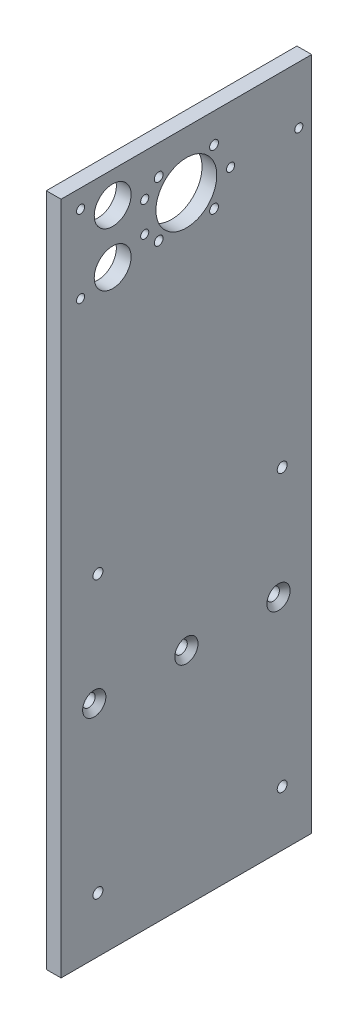
ISO-10303-21;
HEADER;
FILE_DESCRIPTION(('STEP AP214'),'2;1');
FILE_NAME('part.step','',(''),(''),'','','');
FILE_SCHEMA(('AUTOMOTIVE_DESIGN { 1 0 10303 214 1 1 1 1 }'));
ENDSEC;
DATA;
#1=APPLICATION_CONTEXT('core data for automotive mechanical design processes');
#2=APPLICATION_PROTOCOL_DEFINITION('international standard','automotive_design',2000,#1);
#3=PRODUCT_CONTEXT('',#1,'mechanical');
#4=PRODUCT('Part','Part','',(#3));
#5=PRODUCT_RELATED_PRODUCT_CATEGORY('part','',(#4));
#6=PRODUCT_DEFINITION_FORMATION('','',#4);
#7=PRODUCT_DEFINITION_CONTEXT('part definition',#1,'design');
#8=PRODUCT_DEFINITION('design','',#6,#7);
#9=PRODUCT_DEFINITION_SHAPE('','',#8);
#10=(LENGTH_UNIT() NAMED_UNIT(*) SI_UNIT(.MILLI.,.METRE.));
#11=(NAMED_UNIT(*) PLANE_ANGLE_UNIT() SI_UNIT($,.RADIAN.));
#12=(NAMED_UNIT(*) SI_UNIT($,.STERADIAN.) SOLID_ANGLE_UNIT());
#13=UNCERTAINTY_MEASURE_WITH_UNIT(LENGTH_MEASURE(1.E-05),#10,'distance_accuracy_value','');
#14=(GEOMETRIC_REPRESENTATION_CONTEXT(3) GLOBAL_UNCERTAINTY_ASSIGNED_CONTEXT((#13)) GLOBAL_UNIT_ASSIGNED_CONTEXT((#10,
#11,#12)) REPRESENTATION_CONTEXT('',''));
#15=CARTESIAN_POINT('',(0.,0.,0.));
#16=DIRECTION('',(0.,0.,1.));
#17=DIRECTION('',(1.,0.,0.));
#18=AXIS2_PLACEMENT_3D('',#15,#16,#17);
#19=CARTESIAN_POINT('',(4.,0.,0.));
#20=DIRECTION('',(-1.,0.,0.));
#21=DIRECTION('',(0.,0.,1.));
#22=AXIS2_PLACEMENT_3D('',#19,#20,#21);
#23=PLANE('',#22);
#24=CARTESIAN_POINT('',(4.,-75.,-26.));
#25=DIRECTION('',(1.,0.,0.));
#26=DIRECTION('',(0.,0.,-1.));
#27=AXIS2_PLACEMENT_3D('',#24,#25,#26);
#28=CIRCLE('',#27,1.35);
#29=CARTESIAN_POINT('',(4.,-75.,-27.35));
#30=VERTEX_POINT('',#29);
#31=EDGE_CURVE('E306',#30,#30,#28,.T.);
#32=ORIENTED_EDGE('',*,*,#31,.F.);
#33=EDGE_LOOP('',(#32));
#34=FACE_BOUND('',#33,.T.);
#35=CARTESIAN_POINT('',(4.,0.,-26.));
#36=DIRECTION('',(1.,0.,0.));
#37=DIRECTION('',(0.,0.,-1.));
#38=AXIS2_PLACEMENT_3D('',#35,#36,#37);
#39=CIRCLE('',#38,1.35);
#40=CARTESIAN_POINT('',(4.,0.,-27.35));
#41=VERTEX_POINT('',#40);
#42=EDGE_CURVE('E300',#41,#41,#39,.T.);
#43=ORIENTED_EDGE('',*,*,#42,.F.);
#44=EDGE_LOOP('',(#43));
#45=FACE_BOUND('',#44,.T.);
#46=CARTESIAN_POINT('',(4.,-75.,24.));
#47=DIRECTION('',(1.,0.,0.));
#48=DIRECTION('',(0.,0.,-1.));
#49=AXIS2_PLACEMENT_3D('',#46,#47,#48);
#50=CIRCLE('',#49,1.35);
#51=CARTESIAN_POINT('',(4.,-75.,22.65));
#52=VERTEX_POINT('',#51);
#53=EDGE_CURVE('E287',#52,#52,#50,.T.);
#54=ORIENTED_EDGE('',*,*,#53,.F.);
#55=EDGE_LOOP('',(#54));
#56=FACE_BOUND('',#55,.T.);
#57=CARTESIAN_POINT('',(4.,70.,20.));
#58=DIRECTION('',(-1.,0.,0.));
#59=DIRECTION('',(0.,0.,1.));
#60=AXIS2_PLACEMENT_3D('',#57,#58,#59);
#61=CIRCLE('',#60,5.);
#62=CARTESIAN_POINT('',(4.,70.,25.));
#63=VERTEX_POINT('',#62);
#64=EDGE_CURVE('E123',#63,#63,#61,.T.);
#65=ORIENTED_EDGE('',*,*,#64,.T.);
#66=EDGE_LOOP('',(#65));
#67=FACE_BOUND('',#66,.T.);
#68=CARTESIAN_POINT('',(4.,84.6,20.));
#69=DIRECTION('',(-1.,0.,0.));
#70=DIRECTION('',(0.,0.,1.));
#71=AXIS2_PLACEMENT_3D('',#68,#69,#70);
#72=CIRCLE('',#71,5.);
#73=CARTESIAN_POINT('',(4.,84.6,25.));
#74=VERTEX_POINT('',#73);
#75=EDGE_CURVE('E129',#74,#74,#72,.T.);
#76=ORIENTED_EDGE('',*,*,#75,.T.);
#77=EDGE_LOOP('',(#76));
#78=FACE_BOUND('',#77,.T.);
#79=CARTESIAN_POINT('',(4.,88.,28.7));
#80=DIRECTION('',(-1.,0.,0.));
#81=DIRECTION('',(0.,0.,1.));
#82=AXIS2_PLACEMENT_3D('',#79,#80,#81);
#83=CIRCLE('',#82,1.1);
#84=CARTESIAN_POINT('',(4.,88.,29.8));
#85=VERTEX_POINT('',#84);
#86=EDGE_CURVE('E137',#85,#85,#83,.T.);
#87=ORIENTED_EDGE('',*,*,#86,.T.);
#88=EDGE_LOOP('',(#87));
#89=FACE_BOUND('',#88,.T.);
#90=CARTESIAN_POINT('',(4.,67.,28.7));
#91=DIRECTION('',(-1.,0.,0.));
#92=DIRECTION('',(0.,0.,1.));
#93=AXIS2_PLACEMENT_3D('',#90,#91,#92);
#94=CIRCLE('',#93,1.1);
#95=CARTESIAN_POINT('',(4.,67.,29.8));
#96=VERTEX_POINT('',#95);
#97=EDGE_CURVE('E143',#96,#96,#94,.T.);
#98=ORIENTED_EDGE('',*,*,#97,.T.);
#99=EDGE_LOOP('',(#98));
#100=FACE_BOUND('',#99,.T.);
#101=CARTESIAN_POINT('',(4.,81.6,11.3));
#102=DIRECTION('',(-1.,0.,0.));
#103=DIRECTION('',(0.,0.,1.));
#104=AXIS2_PLACEMENT_3D('',#101,#102,#103);
#105=CIRCLE('',#104,1.1);
#106=CARTESIAN_POINT('',(4.,81.6,12.4));
#107=VERTEX_POINT('',#106);
#108=EDGE_CURVE('E149',#107,#107,#105,.T.);
#109=ORIENTED_EDGE('',*,*,#108,.T.);
#110=EDGE_LOOP('',(#109));
#111=FACE_BOUND('',#110,.T.);
#112=CARTESIAN_POINT('',(4.,73.4,11.3));
#113=DIRECTION('',(-1.,0.,0.));
#114=DIRECTION('',(0.,0.,1.));
#115=AXIS2_PLACEMENT_3D('',#112,#113,#114);
#116=CIRCLE('',#115,1.1);
#117=CARTESIAN_POINT('',(4.,73.4,12.4));
#118=VERTEX_POINT('',#117);
#119=EDGE_CURVE('E155',#118,#118,#116,.T.);
#120=ORIENTED_EDGE('',*,*,#119,.T.);
#121=EDGE_LOOP('',(#120));
#122=FACE_BOUND('',#121,.T.);
#123=CARTESIAN_POINT('',(4.,77.5,-12.));
#124=DIRECTION('',(1.,0.,0.));
#125=DIRECTION('',(0.,0.,-1.));
#126=AXIS2_PLACEMENT_3D('',#123,#124,#125);
#127=CIRCLE('',#126,1.1);
#128=CARTESIAN_POINT('',(4.,77.5,-13.1));
#129=VERTEX_POINT('',#128);
#130=EDGE_CURVE('E169',#129,#129,#127,.T.);
#131=ORIENTED_EDGE('',*,*,#130,.F.);
#132=EDGE_LOOP('',(#131));
#133=FACE_BOUND('',#132,.T.);
#134=CARTESIAN_POINT('',(4.,77.5,-30.5));
#135=DIRECTION('',(1.,0.,0.));
#136=DIRECTION('',(0.,0.,-1.));
#137=AXIS2_PLACEMENT_3D('',#134,#135,#136);
#138=CIRCLE('',#137,1.1);
#139=CARTESIAN_POINT('',(4.,77.5,-31.6));
#140=VERTEX_POINT('',#139);
#141=EDGE_CURVE('E175',#140,#140,#138,.T.);
#142=ORIENTED_EDGE('',*,*,#141,.F.);
#143=EDGE_LOOP('',(#142));
#144=FACE_BOUND('',#143,.T.);
#145=CARTESIAN_POINT('',(4.,-30.,25.));
#146=DIRECTION('',(1.,0.,0.));
#147=DIRECTION('',(0.,0.,-1.));
#148=AXIS2_PLACEMENT_3D('',#145,#146,#147);
#149=CIRCLE('',#148,3.15);
#150=CARTESIAN_POINT('',(4.,-30.,21.85));
#151=VERTEX_POINT('',#150);
#152=EDGE_CURVE('E181',#151,#151,#149,.T.);
#153=ORIENTED_EDGE('',*,*,#152,.F.);
#154=EDGE_LOOP('',(#153));
#155=FACE_BOUND('',#154,.T.);
#156=CARTESIAN_POINT('',(4.,-30.,0.));
#157=DIRECTION('',(1.,0.,0.));
#158=DIRECTION('',(0.,0.,-1.));
#159=AXIS2_PLACEMENT_3D('',#156,#157,#158);
#160=CIRCLE('',#159,3.15);
#161=CARTESIAN_POINT('',(4.,-30.,-3.15));
#162=VERTEX_POINT('',#161);
#163=EDGE_CURVE('E187',#162,#162,#160,.T.);
#164=ORIENTED_EDGE('',*,*,#163,.F.);
#165=EDGE_LOOP('',(#164));
#166=FACE_BOUND('',#165,.T.);
#167=CARTESIAN_POINT('',(4.,-30.,-25.));
#168=DIRECTION('',(1.,0.,0.));
#169=DIRECTION('',(0.,0.,-1.));
#170=AXIS2_PLACEMENT_3D('',#167,#168,#169);
#171=CIRCLE('',#170,3.15);
#172=CARTESIAN_POINT('',(4.,-30.,-28.15));
#173=VERTEX_POINT('',#172);
#174=EDGE_CURVE('E194',#173,#173,#171,.T.);
#175=ORIENTED_EDGE('',*,*,#174,.F.);
#176=EDGE_LOOP('',(#175));
#177=FACE_BOUND('',#176,.T.);
#178=CARTESIAN_POINT('',(4.,77.5,0.));
#179=DIRECTION('',(-1.,0.,0.));
#180=DIRECTION('',(0.,0.,1.));
#181=AXIS2_PLACEMENT_3D('',#178,#179,#180);
#182=CIRCLE('',#181,8.25000000000001);
#183=CARTESIAN_POINT('',(4.,77.5,8.25000000000001));
#184=VERTEX_POINT('',#183);
#185=EDGE_CURVE('E201',#184,#184,#182,.T.);
#186=ORIENTED_EDGE('',*,*,#185,.T.);
#187=EDGE_LOOP('',(#186));
#188=FACE_BOUND('',#187,.T.);
#189=CARTESIAN_POINT('',(4.,85.,-7.50000000000003));
#190=DIRECTION('',(-1.,0.,0.));
#191=DIRECTION('',(0.,0.,1.));
#192=AXIS2_PLACEMENT_3D('',#189,#190,#191);
#193=CIRCLE('',#192,1.19999999999999);
#194=CARTESIAN_POINT('',(4.,85.,-6.30000000000004));
#195=VERTEX_POINT('',#194);
#196=EDGE_CURVE('E213',#195,#195,#193,.T.);
#197=ORIENTED_EDGE('',*,*,#196,.T.);
#198=EDGE_LOOP('',(#197));
#199=FACE_BOUND('',#198,.T.);
#200=CARTESIAN_POINT('',(4.,70.,-7.50000000000003));
#201=DIRECTION('',(-1.,0.,0.));
#202=DIRECTION('',(0.,0.,1.));
#203=AXIS2_PLACEMENT_3D('',#200,#201,#202);
#204=CIRCLE('',#203,1.19999999999999);
#205=CARTESIAN_POINT('',(4.,70.,-6.30000000000004));
#206=VERTEX_POINT('',#205);
#207=EDGE_CURVE('E220',#206,#206,#204,.T.);
#208=ORIENTED_EDGE('',*,*,#207,.T.);
#209=EDGE_LOOP('',(#208));
#210=FACE_BOUND('',#209,.T.);
#211=CARTESIAN_POINT('',(4.,85.,7.49999999999999));
#212=DIRECTION('',(-1.,0.,0.));
#213=DIRECTION('',(0.,0.,1.));
#214=AXIS2_PLACEMENT_3D('',#211,#212,#213);
#215=CIRCLE('',#214,1.19999999999999);
#216=CARTESIAN_POINT('',(4.,85.,8.69999999999998));
#217=VERTEX_POINT('',#216);
#218=EDGE_CURVE('E227',#217,#217,#215,.T.);
#219=ORIENTED_EDGE('',*,*,#218,.T.);
#220=EDGE_LOOP('',(#219));
#221=FACE_BOUND('',#220,.T.);
#222=CARTESIAN_POINT('',(4.,70.,7.50000000000003));
#223=DIRECTION('',(-1.,0.,0.));
#224=DIRECTION('',(0.,0.,1.));
#225=AXIS2_PLACEMENT_3D('',#222,#223,#224);
#226=CIRCLE('',#225,1.19999999999999);
#227=CARTESIAN_POINT('',(4.,70.,8.70000000000002));
#228=VERTEX_POINT('',#227);
#229=EDGE_CURVE('E234',#228,#228,#226,.T.);
#230=ORIENTED_EDGE('',*,*,#229,.T.);
#231=EDGE_LOOP('',(#230));
#232=FACE_BOUND('',#231,.T.);
#233=DIRECTION('',(0.,1.,0.));
#234=VECTOR('',#233,1.);
#235=CARTESIAN_POINT('',(4.,-90.,-34.));
#236=LINE('',#235,#234);
#237=CARTESIAN_POINT('',(4.,-90.,-34.));
#238=VERTEX_POINT('',#237);
#239=CARTESIAN_POINT('',(4.,93.,-34.));
#240=VERTEX_POINT('',#239);
#241=EDGE_CURVE('E235',#238,#240,#236,.T.);
#242=ORIENTED_EDGE('',*,*,#241,.T.);
#243=DIRECTION('',(0.,0.,-1.));
#244=VECTOR('',#243,1.);
#245=CARTESIAN_POINT('',(4.,93.,-34.));
#246=LINE('',#245,#244);
#247=CARTESIAN_POINT('',(4.,93.,34.));
#248=VERTEX_POINT('',#247);
#249=EDGE_CURVE('E164',#248,#240,#246,.T.);
#250=ORIENTED_EDGE('',*,*,#249,.F.);
#251=DIRECTION('',(0.,-1.,0.));
#252=VECTOR('',#251,1.);
#253=CARTESIAN_POINT('',(4.,-90.,34.));
#254=LINE('',#253,#252);
#255=CARTESIAN_POINT('',(4.,-90.,34.));
#256=VERTEX_POINT('',#255);
#257=EDGE_CURVE('E237',#248,#256,#254,.T.);
#258=ORIENTED_EDGE('',*,*,#257,.T.);
#259=DIRECTION('',(0.,0.,-1.));
#260=VECTOR('',#259,1.);
#261=CARTESIAN_POINT('',(4.,-90.,34.));
#262=LINE('',#261,#260);
#263=EDGE_CURVE('E56',#256,#238,#262,.T.);
#264=ORIENTED_EDGE('',*,*,#263,.T.);
#265=EDGE_LOOP('',(#242,#250,#258,#264));
#266=FACE_BOUND('',#265,.T.);
#267=CARTESIAN_POINT('',(4.,0.,24.));
#268=DIRECTION('',(1.,0.,0.));
#269=DIRECTION('',(0.,0.,-1.));
#270=AXIS2_PLACEMENT_3D('',#267,#268,#269);
#271=CIRCLE('',#270,1.35);
#272=CARTESIAN_POINT('',(4.,0.,22.65));
#273=VERTEX_POINT('',#272);
#274=EDGE_CURVE('E294',#273,#273,#271,.T.);
#275=ORIENTED_EDGE('',*,*,#274,.F.);
#276=EDGE_LOOP('',(#275));
#277=FACE_BOUND('',#276,.T.);
#278=ADVANCED_FACE('F37',(#34,#45,#56,#67,#78,#89,#100,#111,#122,#133,#144,#155,#166,#177,#188,
#199,#210,#221,#232,#266,#277),#23,.F.);
#279=CARTESIAN_POINT('',(0.,0.,0.));
#280=DIRECTION('',(-1.,0.,0.));
#281=DIRECTION('',(0.,0.,1.));
#282=AXIS2_PLACEMENT_3D('',#279,#280,#281);
#283=PLANE('',#282);
#284=CARTESIAN_POINT('',(0.,-75.,-26.));
#285=DIRECTION('',(1.,0.,0.));
#286=DIRECTION('',(0.,0.,-1.));
#287=AXIS2_PLACEMENT_3D('',#284,#285,#286);
#288=CIRCLE('',#287,1.35);
#289=CARTESIAN_POINT('',(0.,-75.,-27.35));
#290=VERTEX_POINT('',#289);
#291=EDGE_CURVE('E303',#290,#290,#288,.T.);
#292=ORIENTED_EDGE('',*,*,#291,.T.);
#293=EDGE_LOOP('',(#292));
#294=FACE_BOUND('',#293,.T.);
#295=CARTESIAN_POINT('',(0.,0.,-26.));
#296=DIRECTION('',(1.,0.,0.));
#297=DIRECTION('',(0.,0.,-1.));
#298=AXIS2_PLACEMENT_3D('',#295,#296,#297);
#299=CIRCLE('',#298,1.35);
#300=CARTESIAN_POINT('',(0.,0.,-27.35));
#301=VERTEX_POINT('',#300);
#302=EDGE_CURVE('E297',#301,#301,#299,.T.);
#303=ORIENTED_EDGE('',*,*,#302,.T.);
#304=EDGE_LOOP('',(#303));
#305=FACE_BOUND('',#304,.T.);
#306=CARTESIAN_POINT('',(0.,0.,24.));
#307=DIRECTION('',(1.,0.,0.));
#308=DIRECTION('',(0.,0.,-1.));
#309=AXIS2_PLACEMENT_3D('',#306,#307,#308);
#310=CIRCLE('',#309,1.35);
#311=CARTESIAN_POINT('',(0.,0.,22.65));
#312=VERTEX_POINT('',#311);
#313=EDGE_CURVE('E289',#312,#312,#310,.T.);
#314=ORIENTED_EDGE('',*,*,#313,.T.);
#315=EDGE_LOOP('',(#314));
#316=FACE_BOUND('',#315,.T.);
#317=DIRECTION('',(0.,1.,0.));
#318=VECTOR('',#317,1.);
#319=CARTESIAN_POINT('',(0.,-90.,-34.));
#320=LINE('',#319,#318);
#321=CARTESIAN_POINT('',(0.,-90.,-34.));
#322=VERTEX_POINT('',#321);
#323=CARTESIAN_POINT('',(0.,93.,-34.));
#324=VERTEX_POINT('',#323);
#325=EDGE_CURVE('E75',#322,#324,#320,.T.);
#326=ORIENTED_EDGE('',*,*,#325,.F.);
#327=DIRECTION('',(0.,0.,-1.));
#328=VECTOR('',#327,1.);
#329=CARTESIAN_POINT('',(0.,-90.,34.));
#330=LINE('',#329,#328);
#331=CARTESIAN_POINT('',(0.,-90.,34.));
#332=VERTEX_POINT('',#331);
#333=EDGE_CURVE('E238',#332,#322,#330,.T.);
#334=ORIENTED_EDGE('',*,*,#333,.F.);
#335=DIRECTION('',(0.,-1.,0.));
#336=VECTOR('',#335,1.);
#337=CARTESIAN_POINT('',(0.,-90.,34.));
#338=LINE('',#337,#336);
#339=CARTESIAN_POINT('',(0.,93.,34.));
#340=VERTEX_POINT('',#339);
#341=EDGE_CURVE('E67',#340,#332,#338,.T.);
#342=ORIENTED_EDGE('',*,*,#341,.F.);
#343=DIRECTION('',(0.,0.,1.));
#344=VECTOR('',#343,1.);
#345=CARTESIAN_POINT('',(0.,93.,-34.));
#346=LINE('',#345,#344);
#347=EDGE_CURVE('E158',#324,#340,#346,.T.);
#348=ORIENTED_EDGE('',*,*,#347,.F.);
#349=EDGE_LOOP('',(#326,#334,#342,#348));
#350=FACE_BOUND('',#349,.T.);
#351=CARTESIAN_POINT('',(0.,70.,7.50000000000003));
#352=DIRECTION('',(-1.,0.,0.));
#353=DIRECTION('',(0.,0.,1.));
#354=AXIS2_PLACEMENT_3D('',#351,#352,#353);
#355=CIRCLE('',#354,2.19999999999999);
#356=CARTESIAN_POINT('',(0.,70.,9.70000000000002));
#357=VERTEX_POINT('',#356);
#358=EDGE_CURVE('E228',#357,#357,#355,.T.);
#359=ORIENTED_EDGE('',*,*,#358,.F.);
#360=EDGE_LOOP('',(#359));
#361=FACE_BOUND('',#360,.T.);
#362=CARTESIAN_POINT('',(0.,85.,7.49999999999999));
#363=DIRECTION('',(-1.,0.,0.));
#364=DIRECTION('',(0.,0.,1.));
#365=AXIS2_PLACEMENT_3D('',#362,#363,#364);
#366=CIRCLE('',#365,2.19999999999999);
#367=CARTESIAN_POINT('',(0.,85.,9.69999999999999));
#368=VERTEX_POINT('',#367);
#369=EDGE_CURVE('E221',#368,#368,#366,.T.);
#370=ORIENTED_EDGE('',*,*,#369,.F.);
#371=EDGE_LOOP('',(#370));
#372=FACE_BOUND('',#371,.T.);
#373=CARTESIAN_POINT('',(0.,70.,-7.50000000000003));
#374=DIRECTION('',(-1.,0.,0.));
#375=DIRECTION('',(0.,0.,1.));
#376=AXIS2_PLACEMENT_3D('',#373,#374,#375);
#377=CIRCLE('',#376,2.19999999999999);
#378=CARTESIAN_POINT('',(0.,70.,-5.30000000000004));
#379=VERTEX_POINT('',#378);
#380=EDGE_CURVE('E214',#379,#379,#377,.T.);
#381=ORIENTED_EDGE('',*,*,#380,.F.);
#382=EDGE_LOOP('',(#381));
#383=FACE_BOUND('',#382,.T.);
#384=CARTESIAN_POINT('',(0.,85.,-7.50000000000003));
#385=DIRECTION('',(-1.,0.,0.));
#386=DIRECTION('',(0.,0.,1.));
#387=AXIS2_PLACEMENT_3D('',#384,#385,#386);
#388=CIRCLE('',#387,2.19999999999999);
#389=CARTESIAN_POINT('',(0.,85.,-5.30000000000003));
#390=VERTEX_POINT('',#389);
#391=EDGE_CURVE('E204',#390,#390,#388,.T.);
#392=ORIENTED_EDGE('',*,*,#391,.F.);
#393=EDGE_LOOP('',(#392));
#394=FACE_BOUND('',#393,.T.);
#395=CARTESIAN_POINT('',(0.,77.5,0.));
#396=DIRECTION('',(-1.,0.,0.));
#397=DIRECTION('',(0.,0.,1.));
#398=AXIS2_PLACEMENT_3D('',#395,#396,#397);
#399=CIRCLE('',#398,8.25000000000001);
#400=CARTESIAN_POINT('',(0.,77.5,8.25000000000001));
#401=VERTEX_POINT('',#400);
#402=EDGE_CURVE('E205',#401,#401,#399,.T.);
#403=ORIENTED_EDGE('',*,*,#402,.F.);
#404=EDGE_LOOP('',(#403));
#405=FACE_BOUND('',#404,.T.);
#406=CARTESIAN_POINT('',(0.,-30.,-25.));
#407=DIRECTION('',(-1.,0.,0.));
#408=DIRECTION('',(0.,0.,1.));
#409=AXIS2_PLACEMENT_3D('',#406,#407,#408);
#410=CIRCLE('',#409,1.7);
#411=CARTESIAN_POINT('',(0.,-30.,-23.3));
#412=VERTEX_POINT('',#411);
#413=EDGE_CURVE('E200',#412,#412,#410,.T.);
#414=ORIENTED_EDGE('',*,*,#413,.F.);
#415=EDGE_LOOP('',(#414));
#416=FACE_BOUND('',#415,.T.);
#417=CARTESIAN_POINT('',(0.,-30.,0.));
#418=DIRECTION('',(-1.,0.,0.));
#419=DIRECTION('',(0.,0.,1.));
#420=AXIS2_PLACEMENT_3D('',#417,#418,#419);
#421=CIRCLE('',#420,1.7);
#422=CARTESIAN_POINT('',(0.,-30.,1.7));
#423=VERTEX_POINT('',#422);
#424=EDGE_CURVE('E193',#423,#423,#421,.T.);
#425=ORIENTED_EDGE('',*,*,#424,.F.);
#426=EDGE_LOOP('',(#425));
#427=FACE_BOUND('',#426,.T.);
#428=CARTESIAN_POINT('',(0.,-30.,25.));
#429=DIRECTION('',(-1.,0.,0.));
#430=DIRECTION('',(0.,0.,1.));
#431=AXIS2_PLACEMENT_3D('',#428,#429,#430);
#432=CIRCLE('',#431,1.7);
#433=CARTESIAN_POINT('',(0.,-30.,26.7));
#434=VERTEX_POINT('',#433);
#435=EDGE_CURVE('E41',#434,#434,#432,.T.);
#436=ORIENTED_EDGE('',*,*,#435,.F.);
#437=EDGE_LOOP('',(#436));
#438=FACE_BOUND('',#437,.T.);
#439=CARTESIAN_POINT('',(0.,77.5,-30.5));
#440=DIRECTION('',(1.,0.,0.));
#441=DIRECTION('',(0.,0.,-1.));
#442=AXIS2_PLACEMENT_3D('',#439,#440,#441);
#443=CIRCLE('',#442,1.1);
#444=CARTESIAN_POINT('',(0.,77.5,-31.6));
#445=VERTEX_POINT('',#444);
#446=EDGE_CURVE('E178',#445,#445,#443,.T.);
#447=ORIENTED_EDGE('',*,*,#446,.T.);
#448=EDGE_LOOP('',(#447));
#449=FACE_BOUND('',#448,.T.);
#450=CARTESIAN_POINT('',(0.,77.5,-12.));
#451=DIRECTION('',(1.,0.,0.));
#452=DIRECTION('',(0.,0.,-1.));
#453=AXIS2_PLACEMENT_3D('',#450,#451,#452);
#454=CIRCLE('',#453,1.1);
#455=CARTESIAN_POINT('',(0.,77.5,-13.1));
#456=VERTEX_POINT('',#455);
#457=EDGE_CURVE('E172',#456,#456,#454,.T.);
#458=ORIENTED_EDGE('',*,*,#457,.T.);
#459=EDGE_LOOP('',(#458));
#460=FACE_BOUND('',#459,.T.);
#461=CARTESIAN_POINT('',(0.,73.4,11.3));
#462=DIRECTION('',(-1.,0.,0.));
#463=DIRECTION('',(0.,0.,1.));
#464=AXIS2_PLACEMENT_3D('',#461,#462,#463);
#465=CIRCLE('',#464,1.1);
#466=CARTESIAN_POINT('',(0.,73.4,12.4));
#467=VERTEX_POINT('',#466);
#468=EDGE_CURVE('E152',#467,#467,#465,.T.);
#469=ORIENTED_EDGE('',*,*,#468,.F.);
#470=EDGE_LOOP('',(#469));
#471=FACE_BOUND('',#470,.T.);
#472=CARTESIAN_POINT('',(0.,81.6,11.3));
#473=DIRECTION('',(-1.,0.,0.));
#474=DIRECTION('',(0.,0.,1.));
#475=AXIS2_PLACEMENT_3D('',#472,#473,#474);
#476=CIRCLE('',#475,1.1);
#477=CARTESIAN_POINT('',(0.,81.6,12.4));
#478=VERTEX_POINT('',#477);
#479=EDGE_CURVE('E146',#478,#478,#476,.T.);
#480=ORIENTED_EDGE('',*,*,#479,.F.);
#481=EDGE_LOOP('',(#480));
#482=FACE_BOUND('',#481,.T.);
#483=CARTESIAN_POINT('',(0.,67.,28.7));
#484=DIRECTION('',(-1.,0.,0.));
#485=DIRECTION('',(0.,0.,1.));
#486=AXIS2_PLACEMENT_3D('',#483,#484,#485);
#487=CIRCLE('',#486,1.1);
#488=CARTESIAN_POINT('',(0.,67.,29.8));
#489=VERTEX_POINT('',#488);
#490=EDGE_CURVE('E140',#489,#489,#487,.T.);
#491=ORIENTED_EDGE('',*,*,#490,.F.);
#492=EDGE_LOOP('',(#491));
#493=FACE_BOUND('',#492,.T.);
#494=CARTESIAN_POINT('',(0.,88.,28.7));
#495=DIRECTION('',(-1.,0.,0.));
#496=DIRECTION('',(0.,0.,1.));
#497=AXIS2_PLACEMENT_3D('',#494,#495,#496);
#498=CIRCLE('',#497,1.1);
#499=CARTESIAN_POINT('',(0.,88.,29.8));
#500=VERTEX_POINT('',#499);
#501=EDGE_CURVE('E132',#500,#500,#498,.T.);
#502=ORIENTED_EDGE('',*,*,#501,.F.);
#503=EDGE_LOOP('',(#502));
#504=FACE_BOUND('',#503,.T.);
#505=CARTESIAN_POINT('',(0.,84.6,20.));
#506=DIRECTION('',(-1.,0.,0.));
#507=DIRECTION('',(0.,0.,1.));
#508=AXIS2_PLACEMENT_3D('',#505,#506,#507);
#509=CIRCLE('',#508,5.);
#510=CARTESIAN_POINT('',(0.,84.6,25.));
#511=VERTEX_POINT('',#510);
#512=EDGE_CURVE('E126',#511,#511,#509,.T.);
#513=ORIENTED_EDGE('',*,*,#512,.F.);
#514=EDGE_LOOP('',(#513));
#515=FACE_BOUND('',#514,.T.);
#516=CARTESIAN_POINT('',(0.,70.,20.));
#517=DIRECTION('',(-1.,0.,0.));
#518=DIRECTION('',(0.,0.,1.));
#519=AXIS2_PLACEMENT_3D('',#516,#517,#518);
#520=CIRCLE('',#519,5.);
#521=CARTESIAN_POINT('',(0.,70.,25.));
#522=VERTEX_POINT('',#521);
#523=EDGE_CURVE('E122',#522,#522,#520,.T.);
#524=ORIENTED_EDGE('',*,*,#523,.F.);
#525=EDGE_LOOP('',(#524));
#526=FACE_BOUND('',#525,.T.);
#527=CARTESIAN_POINT('',(0.,-75.,24.));
#528=DIRECTION('',(1.,0.,0.));
#529=DIRECTION('',(0.,0.,-1.));
#530=AXIS2_PLACEMENT_3D('',#527,#528,#529);
#531=CIRCLE('',#530,1.35);
#532=CARTESIAN_POINT('',(0.,-75.,22.65));
#533=VERTEX_POINT('',#532);
#534=EDGE_CURVE('E110',#533,#533,#531,.T.);
#535=ORIENTED_EDGE('',*,*,#534,.T.);
#536=EDGE_LOOP('',(#535));
#537=FACE_BOUND('',#536,.T.);
#538=ADVANCED_FACE('F260',(#294,#305,#316,#350,#361,#372,#383,#394,#405,#416,#427,#438,#449,
#460,#471,#482,#493,#504,#515,#526,#537),#283,.T.);
#539=CARTESIAN_POINT('',(4.,-90.,-34.));
#540=DIRECTION('',(0.,0.,1.));
#541=DIRECTION('',(1.,0.,0.));
#542=AXIS2_PLACEMENT_3D('',#539,#540,#541);
#543=PLANE('',#542);
#544=ORIENTED_EDGE('',*,*,#325,.T.);
#545=DIRECTION('',(-1.,0.,0.));
#546=VECTOR('',#545,1.);
#547=CARTESIAN_POINT('',(0.,93.,-34.));
#548=LINE('',#547,#546);
#549=EDGE_CURVE('E167',#240,#324,#548,.T.);
#550=ORIENTED_EDGE('',*,*,#549,.F.);
#551=ORIENTED_EDGE('',*,*,#241,.F.);
#552=DIRECTION('',(-1.,0.,0.));
#553=VECTOR('',#552,1.);
#554=CARTESIAN_POINT('',(4.,-90.,-34.));
#555=LINE('',#554,#553);
#556=EDGE_CURVE('E47',#238,#322,#555,.T.);
#557=ORIENTED_EDGE('',*,*,#556,.T.);
#558=EDGE_LOOP('',(#544,#550,#551,#557));
#559=FACE_BOUND('',#558,.T.);
#560=ADVANCED_FACE('F39',(#559),#543,.F.);
#561=CARTESIAN_POINT('',(4.,-90.,34.));
#562=DIRECTION('',(0.,0.,-1.));
#563=DIRECTION('',(-1.,0.,0.));
#564=AXIS2_PLACEMENT_3D('',#561,#562,#563);
#565=PLANE('',#564);
#566=ORIENTED_EDGE('',*,*,#341,.T.);
#567=DIRECTION('',(-1.,0.,0.));
#568=VECTOR('',#567,1.);
#569=CARTESIAN_POINT('',(4.,-90.,34.));
#570=LINE('',#569,#568);
#571=EDGE_CURVE('E11',#256,#332,#570,.T.);
#572=ORIENTED_EDGE('',*,*,#571,.F.);
#573=ORIENTED_EDGE('',*,*,#257,.F.);
#574=DIRECTION('',(1.,0.,0.));
#575=VECTOR('',#574,1.);
#576=CARTESIAN_POINT('',(0.,93.,34.));
#577=LINE('',#576,#575);
#578=EDGE_CURVE('E161',#340,#248,#577,.T.);
#579=ORIENTED_EDGE('',*,*,#578,.F.);
#580=EDGE_LOOP('',(#566,#572,#573,#579));
#581=FACE_BOUND('',#580,.T.);
#582=ADVANCED_FACE('F484',(#581),#565,.F.);
#583=CARTESIAN_POINT('',(4.,-90.,34.));
#584=DIRECTION('',(0.,1.,0.));
#585=DIRECTION('',(0.,0.,1.));
#586=AXIS2_PLACEMENT_3D('',#583,#584,#585);
#587=PLANE('',#586);
#588=CARTESIAN_POINT('',(2.,-90.,0.));
#589=DIRECTION('',(0.,-1.,0.));
#590=DIRECTION('',(0.,0.,-1.));
#591=AXIS2_PLACEMENT_3D('',#588,#589,#590);
#592=CIRCLE('',#591,1.1);
#593=CARTESIAN_POINT('',(2.,-90.,-1.1));
#594=VERTEX_POINT('',#593);
#595=EDGE_CURVE('E104',#594,#594,#592,.T.);
#596=ORIENTED_EDGE('',*,*,#595,.F.);
#597=EDGE_LOOP('',(#596));
#598=FACE_BOUND('',#597,.T.);
#599=CARTESIAN_POINT('',(2.,-90.,25.));
#600=DIRECTION('',(0.,-1.,0.));
#601=DIRECTION('',(0.,0.,-1.));
#602=AXIS2_PLACEMENT_3D('',#599,#600,#601);
#603=CIRCLE('',#602,1.1);
#604=CARTESIAN_POINT('',(2.,-90.,23.9));
#605=VERTEX_POINT('',#604);
#606=EDGE_CURVE('E103',#605,#605,#603,.T.);
#607=ORIENTED_EDGE('',*,*,#606,.F.);
#608=EDGE_LOOP('',(#607));
#609=FACE_BOUND('',#608,.T.);
#610=CARTESIAN_POINT('',(2.,-90.,-25.));
#611=DIRECTION('',(0.,-1.,0.));
#612=DIRECTION('',(0.,0.,-1.));
#613=AXIS2_PLACEMENT_3D('',#610,#611,#612);
#614=CIRCLE('',#613,1.1);
#615=CARTESIAN_POINT('',(2.,-90.,-26.1));
#616=VERTEX_POINT('',#615);
#617=EDGE_CURVE('E116',#616,#616,#614,.T.);
#618=ORIENTED_EDGE('',*,*,#617,.F.);
#619=EDGE_LOOP('',(#618));
#620=FACE_BOUND('',#619,.T.);
#621=ORIENTED_EDGE('',*,*,#333,.T.);
#622=ORIENTED_EDGE('',*,*,#556,.F.);
#623=ORIENTED_EDGE('',*,*,#263,.F.);
#624=ORIENTED_EDGE('',*,*,#571,.T.);
#625=EDGE_LOOP('',(#621,#622,#623,#624));
#626=FACE_BOUND('',#625,.T.);
#627=ADVANCED_FACE('F480',(#598,#609,#620,#626),#587,.F.);
#628=CARTESIAN_POINT('',(0.,70.,7.50000000000003));
#629=DIRECTION('',(-1.,0.,0.));
#630=DIRECTION('',(0.,0.,1.));
#631=AXIS2_PLACEMENT_3D('',#628,#629,#630);
#632=CYLINDRICAL_SURFACE('',#631,1.19999999999999);
#633=CARTESIAN_POINT('',(1.,70.,7.50000000000003));
#634=DIRECTION('',(-1.,0.,0.));
#635=DIRECTION('',(0.,0.,1.));
#636=AXIS2_PLACEMENT_3D('',#633,#634,#635);
#637=CIRCLE('',#636,1.19999999999999);
#638=CARTESIAN_POINT('',(1.,70.,8.70000000000002));
#639=VERTEX_POINT('',#638);
#640=EDGE_CURVE('E231',#639,#639,#637,.T.);
#641=ORIENTED_EDGE('',*,*,#640,.T.);
#642=EDGE_LOOP('',(#641));
#643=FACE_BOUND('',#642,.T.);
#644=ORIENTED_EDGE('',*,*,#229,.F.);
#645=EDGE_LOOP('',(#644));
#646=FACE_BOUND('',#645,.T.);
#647=ADVANCED_FACE('F477',(#643,#646),#632,.F.);
#648=CARTESIAN_POINT('',(0.,70.,7.50000000000003));
#649=DIRECTION('',(-1.,0.,0.));
#650=DIRECTION('',(0.,0.,1.));
#651=AXIS2_PLACEMENT_3D('',#648,#649,#650);
#652=CONICAL_SURFACE('',#651,2.19999999999999,0.785398163397448);
#653=ORIENTED_EDGE('',*,*,#640,.F.);
#654=EDGE_LOOP('',(#653));
#655=FACE_BOUND('',#654,.T.);
#656=ORIENTED_EDGE('',*,*,#358,.T.);
#657=EDGE_LOOP('',(#656));
#658=FACE_BOUND('',#657,.T.);
#659=ADVANCED_FACE('F473',(#655,#658),#652,.F.);
#660=CARTESIAN_POINT('',(0.,85.,7.49999999999999));
#661=DIRECTION('',(-1.,0.,0.));
#662=DIRECTION('',(0.,0.,1.));
#663=AXIS2_PLACEMENT_3D('',#660,#661,#662);
#664=CYLINDRICAL_SURFACE('',#663,1.19999999999999);
#665=CARTESIAN_POINT('',(1.,85.,7.49999999999999));
#666=DIRECTION('',(-1.,0.,0.));
#667=DIRECTION('',(0.,0.,1.));
#668=AXIS2_PLACEMENT_3D('',#665,#666,#667);
#669=CIRCLE('',#668,1.19999999999999);
#670=CARTESIAN_POINT('',(1.,85.,8.69999999999998));
#671=VERTEX_POINT('',#670);
#672=EDGE_CURVE('E224',#671,#671,#669,.T.);
#673=ORIENTED_EDGE('',*,*,#672,.T.);
#674=EDGE_LOOP('',(#673));
#675=FACE_BOUND('',#674,.T.);
#676=ORIENTED_EDGE('',*,*,#218,.F.);
#677=EDGE_LOOP('',(#676));
#678=FACE_BOUND('',#677,.T.);
#679=ADVANCED_FACE('F469',(#675,#678),#664,.F.);
#680=CARTESIAN_POINT('',(0.,85.,7.49999999999999));
#681=DIRECTION('',(-1.,0.,0.));
#682=DIRECTION('',(0.,0.,1.));
#683=AXIS2_PLACEMENT_3D('',#680,#681,#682);
#684=CONICAL_SURFACE('',#683,2.19999999999999,0.785398163397448);
#685=ORIENTED_EDGE('',*,*,#672,.F.);
#686=EDGE_LOOP('',(#685));
#687=FACE_BOUND('',#686,.T.);
#688=ORIENTED_EDGE('',*,*,#369,.T.);
#689=EDGE_LOOP('',(#688));
#690=FACE_BOUND('',#689,.T.);
#691=ADVANCED_FACE('F465',(#687,#690),#684,.F.);
#692=CARTESIAN_POINT('',(0.,70.,-7.50000000000003));
#693=DIRECTION('',(-1.,0.,0.));
#694=DIRECTION('',(0.,0.,1.));
#695=AXIS2_PLACEMENT_3D('',#692,#693,#694);
#696=CYLINDRICAL_SURFACE('',#695,1.19999999999999);
#697=CARTESIAN_POINT('',(1.,70.,-7.50000000000003));
#698=DIRECTION('',(-1.,0.,0.));
#699=DIRECTION('',(0.,0.,1.));
#700=AXIS2_PLACEMENT_3D('',#697,#698,#699);
#701=CIRCLE('',#700,1.19999999999999);
#702=CARTESIAN_POINT('',(1.,70.,-6.30000000000004));
#703=VERTEX_POINT('',#702);
#704=EDGE_CURVE('E217',#703,#703,#701,.T.);
#705=ORIENTED_EDGE('',*,*,#704,.T.);
#706=EDGE_LOOP('',(#705));
#707=FACE_BOUND('',#706,.T.);
#708=ORIENTED_EDGE('',*,*,#207,.F.);
#709=EDGE_LOOP('',(#708));
#710=FACE_BOUND('',#709,.T.);
#711=ADVANCED_FACE('F461',(#707,#710),#696,.F.);
#712=CARTESIAN_POINT('',(0.,70.,-7.50000000000003));
#713=DIRECTION('',(-1.,0.,0.));
#714=DIRECTION('',(0.,0.,1.));
#715=AXIS2_PLACEMENT_3D('',#712,#713,#714);
#716=CONICAL_SURFACE('',#715,2.19999999999999,0.785398163397448);
#717=ORIENTED_EDGE('',*,*,#704,.F.);
#718=EDGE_LOOP('',(#717));
#719=FACE_BOUND('',#718,.T.);
#720=ORIENTED_EDGE('',*,*,#380,.T.);
#721=EDGE_LOOP('',(#720));
#722=FACE_BOUND('',#721,.T.);
#723=ADVANCED_FACE('F457',(#719,#722),#716,.F.);
#724=CARTESIAN_POINT('',(0.,85.,-7.50000000000003));
#725=DIRECTION('',(-1.,0.,0.));
#726=DIRECTION('',(0.,0.,1.));
#727=AXIS2_PLACEMENT_3D('',#724,#725,#726);
#728=CYLINDRICAL_SURFACE('',#727,1.19999999999999);
#729=CARTESIAN_POINT('',(1.,85.,-7.50000000000003));
#730=DIRECTION('',(-1.,0.,0.));
#731=DIRECTION('',(0.,0.,1.));
#732=AXIS2_PLACEMENT_3D('',#729,#730,#731);
#733=CIRCLE('',#732,1.19999999999999);
#734=CARTESIAN_POINT('',(1.,85.,-6.30000000000004));
#735=VERTEX_POINT('',#734);
#736=EDGE_CURVE('E210',#735,#735,#733,.T.);
#737=ORIENTED_EDGE('',*,*,#736,.T.);
#738=EDGE_LOOP('',(#737));
#739=FACE_BOUND('',#738,.T.);
#740=ORIENTED_EDGE('',*,*,#196,.F.);
#741=EDGE_LOOP('',(#740));
#742=FACE_BOUND('',#741,.T.);
#743=ADVANCED_FACE('F453',(#739,#742),#728,.F.);
#744=CARTESIAN_POINT('',(0.,85.,-7.50000000000003));
#745=DIRECTION('',(-1.,0.,0.));
#746=DIRECTION('',(0.,0.,1.));
#747=AXIS2_PLACEMENT_3D('',#744,#745,#746);
#748=CONICAL_SURFACE('',#747,2.19999999999999,0.785398163397448);
#749=ORIENTED_EDGE('',*,*,#736,.F.);
#750=EDGE_LOOP('',(#749));
#751=FACE_BOUND('',#750,.T.);
#752=ORIENTED_EDGE('',*,*,#391,.T.);
#753=EDGE_LOOP('',(#752));
#754=FACE_BOUND('',#753,.T.);
#755=ADVANCED_FACE('F449',(#751,#754),#748,.F.);
#756=CARTESIAN_POINT('',(4.,77.5,0.));
#757=DIRECTION('',(-1.,0.,0.));
#758=DIRECTION('',(0.,0.,1.));
#759=AXIS2_PLACEMENT_3D('',#756,#757,#758);
#760=CYLINDRICAL_SURFACE('',#759,8.25000000000001);
#761=ORIENTED_EDGE('',*,*,#185,.F.);
#762=EDGE_LOOP('',(#761));
#763=FACE_BOUND('',#762,.T.);
#764=ORIENTED_EDGE('',*,*,#402,.T.);
#765=EDGE_LOOP('',(#764));
#766=FACE_BOUND('',#765,.T.);
#767=ADVANCED_FACE('F445',(#763,#766),#760,.F.);
#768=CARTESIAN_POINT('',(4.,-30.,-25.));
#769=DIRECTION('',(1.,0.,0.));
#770=DIRECTION('',(0.,0.,-1.));
#771=AXIS2_PLACEMENT_3D('',#768,#769,#770);
#772=CYLINDRICAL_SURFACE('',#771,1.7);
#773=ORIENTED_EDGE('',*,*,#413,.T.);
#774=EDGE_LOOP('',(#773));
#775=FACE_BOUND('',#774,.T.);
#776=CARTESIAN_POINT('',(2.55,-30.,-25.));
#777=DIRECTION('',(1.,0.,0.));
#778=DIRECTION('',(0.,0.,-1.));
#779=AXIS2_PLACEMENT_3D('',#776,#777,#778);
#780=CIRCLE('',#779,1.7);
#781=CARTESIAN_POINT('',(2.55,-30.,-26.7));
#782=VERTEX_POINT('',#781);
#783=EDGE_CURVE('E197',#782,#782,#780,.T.);
#784=ORIENTED_EDGE('',*,*,#783,.T.);
#785=EDGE_LOOP('',(#784));
#786=FACE_BOUND('',#785,.T.);
#787=ADVANCED_FACE('F441',(#775,#786),#772,.F.);
#788=CARTESIAN_POINT('',(4.,-30.,-25.));
#789=DIRECTION('',(1.,0.,0.));
#790=DIRECTION('',(0.,0.,-1.));
#791=AXIS2_PLACEMENT_3D('',#788,#789,#790);
#792=CONICAL_SURFACE('',#791,3.15,0.785398163397448);
#793=ORIENTED_EDGE('',*,*,#783,.F.);
#794=EDGE_LOOP('',(#793));
#795=FACE_BOUND('',#794,.T.);
#796=ORIENTED_EDGE('',*,*,#174,.T.);
#797=EDGE_LOOP('',(#796));
#798=FACE_BOUND('',#797,.T.);
#799=ADVANCED_FACE('F438',(#795,#798),#792,.F.);
#800=CARTESIAN_POINT('',(4.,-30.,0.));
#801=DIRECTION('',(1.,0.,0.));
#802=DIRECTION('',(0.,0.,-1.));
#803=AXIS2_PLACEMENT_3D('',#800,#801,#802);
#804=CYLINDRICAL_SURFACE('',#803,1.7);
#805=ORIENTED_EDGE('',*,*,#424,.T.);
#806=EDGE_LOOP('',(#805));
#807=FACE_BOUND('',#806,.T.);
#808=CARTESIAN_POINT('',(2.55,-30.,0.));
#809=DIRECTION('',(1.,0.,0.));
#810=DIRECTION('',(0.,0.,-1.));
#811=AXIS2_PLACEMENT_3D('',#808,#809,#810);
#812=CIRCLE('',#811,1.7);
#813=CARTESIAN_POINT('',(2.55,-30.,-1.7));
#814=VERTEX_POINT('',#813);
#815=EDGE_CURVE('E190',#814,#814,#812,.T.);
#816=ORIENTED_EDGE('',*,*,#815,.T.);
#817=EDGE_LOOP('',(#816));
#818=FACE_BOUND('',#817,.T.);
#819=ADVANCED_FACE('F257',(#807,#818),#804,.F.);
#820=CARTESIAN_POINT('',(4.,-30.,0.));
#821=DIRECTION('',(1.,0.,0.));
#822=DIRECTION('',(0.,0.,-1.));
#823=AXIS2_PLACEMENT_3D('',#820,#821,#822);
#824=CONICAL_SURFACE('',#823,3.15,0.785398163397448);
#825=ORIENTED_EDGE('',*,*,#815,.F.);
#826=EDGE_LOOP('',(#825));
#827=FACE_BOUND('',#826,.T.);
#828=ORIENTED_EDGE('',*,*,#163,.T.);
#829=EDGE_LOOP('',(#828));
#830=FACE_BOUND('',#829,.T.);
#831=ADVANCED_FACE('F431',(#827,#830),#824,.F.);
#832=CARTESIAN_POINT('',(4.,-30.,25.));
#833=DIRECTION('',(1.,0.,0.));
#834=DIRECTION('',(0.,0.,-1.));
#835=AXIS2_PLACEMENT_3D('',#832,#833,#834);
#836=CYLINDRICAL_SURFACE('',#835,1.7);
#837=ORIENTED_EDGE('',*,*,#435,.T.);
#838=EDGE_LOOP('',(#837));
#839=FACE_BOUND('',#838,.T.);
#840=CARTESIAN_POINT('',(2.55,-30.,25.));
#841=DIRECTION('',(1.,0.,0.));
#842=DIRECTION('',(0.,0.,-1.));
#843=AXIS2_PLACEMENT_3D('',#840,#841,#842);
#844=CIRCLE('',#843,1.7);
#845=CARTESIAN_POINT('',(2.55,-30.,23.3));
#846=VERTEX_POINT('',#845);
#847=EDGE_CURVE('E184',#846,#846,#844,.T.);
#848=ORIENTED_EDGE('',*,*,#847,.T.);
#849=EDGE_LOOP('',(#848));
#850=FACE_BOUND('',#849,.T.);
#851=ADVANCED_FACE('F427',(#839,#850),#836,.F.);
#852=CARTESIAN_POINT('',(4.,-30.,25.));
#853=DIRECTION('',(1.,0.,0.));
#854=DIRECTION('',(0.,0.,-1.));
#855=AXIS2_PLACEMENT_3D('',#852,#853,#854);
#856=CONICAL_SURFACE('',#855,3.15,0.785398163397448);
#857=ORIENTED_EDGE('',*,*,#847,.F.);
#858=EDGE_LOOP('',(#857));
#859=FACE_BOUND('',#858,.T.);
#860=ORIENTED_EDGE('',*,*,#152,.T.);
#861=EDGE_LOOP('',(#860));
#862=FACE_BOUND('',#861,.T.);
#863=ADVANCED_FACE('F423',(#859,#862),#856,.F.);
#864=CARTESIAN_POINT('',(4.,77.5,-30.5));
#865=DIRECTION('',(1.,0.,0.));
#866=DIRECTION('',(0.,0.,-1.));
#867=AXIS2_PLACEMENT_3D('',#864,#865,#866);
#868=CYLINDRICAL_SURFACE('',#867,1.1);
#869=ORIENTED_EDGE('',*,*,#446,.F.);
#870=EDGE_LOOP('',(#869));
#871=FACE_BOUND('',#870,.T.);
#872=ORIENTED_EDGE('',*,*,#141,.T.);
#873=EDGE_LOOP('',(#872));
#874=FACE_BOUND('',#873,.T.);
#875=ADVANCED_FACE('F419',(#871,#874),#868,.F.);
#876=CARTESIAN_POINT('',(4.,77.5,-12.));
#877=DIRECTION('',(1.,0.,0.));
#878=DIRECTION('',(0.,0.,-1.));
#879=AXIS2_PLACEMENT_3D('',#876,#877,#878);
#880=CYLINDRICAL_SURFACE('',#879,1.1);
#881=ORIENTED_EDGE('',*,*,#457,.F.);
#882=EDGE_LOOP('',(#881));
#883=FACE_BOUND('',#882,.T.);
#884=ORIENTED_EDGE('',*,*,#130,.T.);
#885=EDGE_LOOP('',(#884));
#886=FACE_BOUND('',#885,.T.);
#887=ADVANCED_FACE('F415',(#883,#886),#880,.F.);
#888=CARTESIAN_POINT('',(0.,93.,0.));
#889=DIRECTION('',(0.,1.,0.));
#890=DIRECTION('',(0.,0.,1.));
#891=AXIS2_PLACEMENT_3D('',#888,#889,#890);
#892=PLANE('',#891);
#893=ORIENTED_EDGE('',*,*,#347,.T.);
#894=ORIENTED_EDGE('',*,*,#578,.T.);
#895=ORIENTED_EDGE('',*,*,#249,.T.);
#896=ORIENTED_EDGE('',*,*,#549,.T.);
#897=EDGE_LOOP('',(#893,#894,#895,#896));
#898=FACE_BOUND('',#897,.T.);
#899=ADVANCED_FACE('F411',(#898),#892,.T.);
#900=CARTESIAN_POINT('',(0.,73.4,11.3));
#901=DIRECTION('',(-1.,0.,0.));
#902=DIRECTION('',(0.,0.,1.));
#903=AXIS2_PLACEMENT_3D('',#900,#901,#902);
#904=CYLINDRICAL_SURFACE('',#903,1.1);
#905=ORIENTED_EDGE('',*,*,#468,.T.);
#906=EDGE_LOOP('',(#905));
#907=FACE_BOUND('',#906,.T.);
#908=ORIENTED_EDGE('',*,*,#119,.F.);
#909=EDGE_LOOP('',(#908));
#910=FACE_BOUND('',#909,.T.);
#911=ADVANCED_FACE('F407',(#907,#910),#904,.F.);
#912=CARTESIAN_POINT('',(0.,81.6,11.3));
#913=DIRECTION('',(-1.,0.,0.));
#914=DIRECTION('',(0.,0.,1.));
#915=AXIS2_PLACEMENT_3D('',#912,#913,#914);
#916=CYLINDRICAL_SURFACE('',#915,1.1);
#917=ORIENTED_EDGE('',*,*,#479,.T.);
#918=EDGE_LOOP('',(#917));
#919=FACE_BOUND('',#918,.T.);
#920=ORIENTED_EDGE('',*,*,#108,.F.);
#921=EDGE_LOOP('',(#920));
#922=FACE_BOUND('',#921,.T.);
#923=ADVANCED_FACE('F403',(#919,#922),#916,.F.);
#924=CARTESIAN_POINT('',(0.,67.,28.7));
#925=DIRECTION('',(-1.,0.,0.));
#926=DIRECTION('',(0.,0.,1.));
#927=AXIS2_PLACEMENT_3D('',#924,#925,#926);
#928=CYLINDRICAL_SURFACE('',#927,1.1);
#929=ORIENTED_EDGE('',*,*,#490,.T.);
#930=EDGE_LOOP('',(#929));
#931=FACE_BOUND('',#930,.T.);
#932=ORIENTED_EDGE('',*,*,#97,.F.);
#933=EDGE_LOOP('',(#932));
#934=FACE_BOUND('',#933,.T.);
#935=ADVANCED_FACE('F399',(#931,#934),#928,.F.);
#936=CARTESIAN_POINT('',(0.,88.,28.7));
#937=DIRECTION('',(-1.,0.,0.));
#938=DIRECTION('',(0.,0.,1.));
#939=AXIS2_PLACEMENT_3D('',#936,#937,#938);
#940=CYLINDRICAL_SURFACE('',#939,1.1);
#941=ORIENTED_EDGE('',*,*,#501,.T.);
#942=EDGE_LOOP('',(#941));
#943=FACE_BOUND('',#942,.T.);
#944=ORIENTED_EDGE('',*,*,#86,.F.);
#945=EDGE_LOOP('',(#944));
#946=FACE_BOUND('',#945,.T.);
#947=ADVANCED_FACE('F395',(#943,#946),#940,.F.);
#948=CARTESIAN_POINT('',(4.,84.6,20.));
#949=DIRECTION('',(-1.,0.,0.));
#950=DIRECTION('',(0.,0.,1.));
#951=AXIS2_PLACEMENT_3D('',#948,#949,#950);
#952=CYLINDRICAL_SURFACE('',#951,5.);
#953=ORIENTED_EDGE('',*,*,#75,.F.);
#954=EDGE_LOOP('',(#953));
#955=FACE_BOUND('',#954,.T.);
#956=ORIENTED_EDGE('',*,*,#512,.T.);
#957=EDGE_LOOP('',(#956));
#958=FACE_BOUND('',#957,.T.);
#959=ADVANCED_FACE('F391',(#955,#958),#952,.F.);
#960=CARTESIAN_POINT('',(4.,70.,20.));
#961=DIRECTION('',(-1.,0.,0.));
#962=DIRECTION('',(0.,0.,1.));
#963=AXIS2_PLACEMENT_3D('',#960,#961,#962);
#964=CYLINDRICAL_SURFACE('',#963,5.);
#965=ORIENTED_EDGE('',*,*,#64,.F.);
#966=EDGE_LOOP('',(#965));
#967=FACE_BOUND('',#966,.T.);
#968=ORIENTED_EDGE('',*,*,#523,.T.);
#969=EDGE_LOOP('',(#968));
#970=FACE_BOUND('',#969,.T.);
#971=ADVANCED_FACE('F387',(#967,#970),#964,.F.);
#972=CARTESIAN_POINT('',(2.,-82.75,-25.));
#973=DIRECTION('',(0.,-1.,0.));
#974=DIRECTION('',(0.,0.,-1.));
#975=AXIS2_PLACEMENT_3D('',#972,#973,#974);
#976=CONICAL_SURFACE('',#975,1.1,1.02974425867666);
#977=CARTESIAN_POINT('',(2.,-82.0890533190697,-25.));
#978=VERTEX_POINT('',#977);
#979=VERTEX_LOOP('',#978);
#980=FACE_BOUND('',#979,.T.);
#981=CARTESIAN_POINT('',(2.,-82.75,-25.));
#982=DIRECTION('',(0.,-1.,0.));
#983=DIRECTION('',(0.,0.,-1.));
#984=AXIS2_PLACEMENT_3D('',#981,#982,#983);
#985=CIRCLE('',#984,1.1);
#986=CARTESIAN_POINT('',(2.,-82.75,-26.1));
#987=VERTEX_POINT('',#986);
#988=EDGE_CURVE('E119',#987,#987,#985,.T.);
#989=ORIENTED_EDGE('',*,*,#988,.T.);
#990=EDGE_LOOP('',(#989));
#991=FACE_BOUND('',#990,.T.);
#992=ADVANCED_FACE('F383',(#980,#991),#976,.F.);
#993=CARTESIAN_POINT('',(2.,-90.,-25.));
#994=DIRECTION('',(0.,-1.,0.));
#995=DIRECTION('',(0.,0.,-1.));
#996=AXIS2_PLACEMENT_3D('',#993,#994,#995);
#997=CYLINDRICAL_SURFACE('',#996,1.1);
#998=ORIENTED_EDGE('',*,*,#988,.F.);
#999=EDGE_LOOP('',(#998));
#1000=FACE_BOUND('',#999,.T.);
#1001=ORIENTED_EDGE('',*,*,#617,.T.);
#1002=EDGE_LOOP('',(#1001));
#1003=FACE_BOUND('',#1002,.T.);
#1004=ADVANCED_FACE('F379',(#1000,#1003),#997,.F.);
#1005=CARTESIAN_POINT('',(2.,-82.75,25.));
#1006=DIRECTION('',(0.,-1.,0.));
#1007=DIRECTION('',(0.,0.,-1.));
#1008=AXIS2_PLACEMENT_3D('',#1005,#1006,#1007);
#1009=CONICAL_SURFACE('',#1008,1.1,1.02974425867666);
#1010=CARTESIAN_POINT('',(2.,-82.0890533190697,25.));
#1011=VERTEX_POINT('',#1010);
#1012=VERTEX_LOOP('',#1011);
#1013=FACE_BOUND('',#1012,.T.);
#1014=CARTESIAN_POINT('',(2.,-82.75,25.));
#1015=DIRECTION('',(0.,-1.,0.));
#1016=DIRECTION('',(0.,0.,-1.));
#1017=AXIS2_PLACEMENT_3D('',#1014,#1015,#1016);
#1018=CIRCLE('',#1017,1.1);
#1019=CARTESIAN_POINT('',(2.,-82.75,23.9));
#1020=VERTEX_POINT('',#1019);
#1021=EDGE_CURVE('E107',#1020,#1020,#1018,.T.);
#1022=ORIENTED_EDGE('',*,*,#1021,.T.);
#1023=EDGE_LOOP('',(#1022));
#1024=FACE_BOUND('',#1023,.T.);
#1025=ADVANCED_FACE('F375',(#1013,#1024),#1009,.F.);
#1026=CARTESIAN_POINT('',(2.,-90.,25.));
#1027=DIRECTION('',(0.,-1.,0.));
#1028=DIRECTION('',(0.,0.,-1.));
#1029=AXIS2_PLACEMENT_3D('',#1026,#1027,#1028);
#1030=CYLINDRICAL_SURFACE('',#1029,1.1);
#1031=ORIENTED_EDGE('',*,*,#1021,.F.);
#1032=EDGE_LOOP('',(#1031));
#1033=FACE_BOUND('',#1032,.T.);
#1034=ORIENTED_EDGE('',*,*,#606,.T.);
#1035=EDGE_LOOP('',(#1034));
#1036=FACE_BOUND('',#1035,.T.);
#1037=ADVANCED_FACE('F97',(#1033,#1036),#1030,.F.);
#1038=CARTESIAN_POINT('',(2.,-82.75,0.));
#1039=DIRECTION('',(0.,-1.,0.));
#1040=DIRECTION('',(0.,0.,-1.));
#1041=AXIS2_PLACEMENT_3D('',#1038,#1039,#1040);
#1042=CONICAL_SURFACE('',#1041,1.1,1.02974425867666);
#1043=CARTESIAN_POINT('',(2.,-82.0890533190697,0.));
#1044=VERTEX_POINT('',#1043);
#1045=VERTEX_LOOP('',#1044);
#1046=FACE_BOUND('',#1045,.T.);
#1047=CARTESIAN_POINT('',(2.,-82.75,0.));
#1048=DIRECTION('',(0.,-1.,0.));
#1049=DIRECTION('',(0.,0.,-1.));
#1050=AXIS2_PLACEMENT_3D('',#1047,#1048,#1049);
#1051=CIRCLE('',#1050,1.1);
#1052=CARTESIAN_POINT('',(2.,-82.75,-1.1));
#1053=VERTEX_POINT('',#1052);
#1054=EDGE_CURVE('E101',#1053,#1053,#1051,.T.);
#1055=ORIENTED_EDGE('',*,*,#1054,.T.);
#1056=EDGE_LOOP('',(#1055));
#1057=FACE_BOUND('',#1056,.T.);
#1058=ADVANCED_FACE('F93',(#1046,#1057),#1042,.F.);
#1059=CARTESIAN_POINT('',(2.,-90.,0.));
#1060=DIRECTION('',(0.,-1.,0.));
#1061=DIRECTION('',(0.,0.,-1.));
#1062=AXIS2_PLACEMENT_3D('',#1059,#1060,#1061);
#1063=CYLINDRICAL_SURFACE('',#1062,1.1);
#1064=ORIENTED_EDGE('',*,*,#1054,.F.);
#1065=EDGE_LOOP('',(#1064));
#1066=FACE_BOUND('',#1065,.T.);
#1067=ORIENTED_EDGE('',*,*,#595,.T.);
#1068=EDGE_LOOP('',(#1067));
#1069=FACE_BOUND('',#1068,.T.);
#1070=ADVANCED_FACE('F96',(#1066,#1069),#1063,.F.);
#1071=CARTESIAN_POINT('',(4.,-75.,24.));
#1072=DIRECTION('',(1.,0.,0.));
#1073=DIRECTION('',(0.,0.,-1.));
#1074=AXIS2_PLACEMENT_3D('',#1071,#1072,#1073);
#1075=CYLINDRICAL_SURFACE('',#1074,1.35);
#1076=ORIENTED_EDGE('',*,*,#534,.F.);
#1077=EDGE_LOOP('',(#1076));
#1078=FACE_BOUND('',#1077,.T.);
#1079=ORIENTED_EDGE('',*,*,#53,.T.);
#1080=EDGE_LOOP('',(#1079));
#1081=FACE_BOUND('',#1080,.T.);
#1082=ADVANCED_FACE('F358',(#1078,#1081),#1075,.F.);
#1083=CARTESIAN_POINT('',(4.,0.,24.));
#1084=DIRECTION('',(1.,0.,0.));
#1085=DIRECTION('',(0.,0.,-1.));
#1086=AXIS2_PLACEMENT_3D('',#1083,#1084,#1085);
#1087=CYLINDRICAL_SURFACE('',#1086,1.35);
#1088=ORIENTED_EDGE('',*,*,#313,.F.);
#1089=EDGE_LOOP('',(#1088));
#1090=FACE_BOUND('',#1089,.T.);
#1091=ORIENTED_EDGE('',*,*,#274,.T.);
#1092=EDGE_LOOP('',(#1091));
#1093=FACE_BOUND('',#1092,.T.);
#1094=ADVANCED_FACE('F355',(#1090,#1093),#1087,.F.);
#1095=CARTESIAN_POINT('',(4.,0.,-26.));
#1096=DIRECTION('',(1.,0.,0.));
#1097=DIRECTION('',(0.,0.,-1.));
#1098=AXIS2_PLACEMENT_3D('',#1095,#1096,#1097);
#1099=CYLINDRICAL_SURFACE('',#1098,1.35);
#1100=ORIENTED_EDGE('',*,*,#302,.F.);
#1101=EDGE_LOOP('',(#1100));
#1102=FACE_BOUND('',#1101,.T.);
#1103=ORIENTED_EDGE('',*,*,#42,.T.);
#1104=EDGE_LOOP('',(#1103));
#1105=FACE_BOUND('',#1104,.T.);
#1106=ADVANCED_FACE('F357',(#1102,#1105),#1099,.F.);
#1107=CARTESIAN_POINT('',(4.,-75.,-26.));
#1108=DIRECTION('',(1.,0.,0.));
#1109=DIRECTION('',(0.,0.,-1.));
#1110=AXIS2_PLACEMENT_3D('',#1107,#1108,#1109);
#1111=CYLINDRICAL_SURFACE('',#1110,1.35);
#1112=ORIENTED_EDGE('',*,*,#291,.F.);
#1113=EDGE_LOOP('',(#1112));
#1114=FACE_BOUND('',#1113,.T.);
#1115=ORIENTED_EDGE('',*,*,#31,.T.);
#1116=EDGE_LOOP('',(#1115));
#1117=FACE_BOUND('',#1116,.T.);
#1118=ADVANCED_FACE('F310',(#1114,#1117),#1111,.F.);
#1119=CLOSED_SHELL('',(#278,#538,#560,#582,#627,#647,#659,#679,#691,#711,#723,#743,#755,#767,
#787,#799,#819,#831,#851,#863,#875,#887,#899,#911,#923,#935,#947,#959,#971,#992,#1004,#1025,
#1037,#1058,#1070,#1082,#1094,#1106,#1118));
#1120=MANIFOLD_SOLID_BREP('B2',#1119);
#1121=ADVANCED_BREP_SHAPE_REPRESENTATION('',(#18,#1120),#14);
#1122=SHAPE_DEFINITION_REPRESENTATION(#9,#1121);
ENDSEC;
END-ISO-10303-21;
